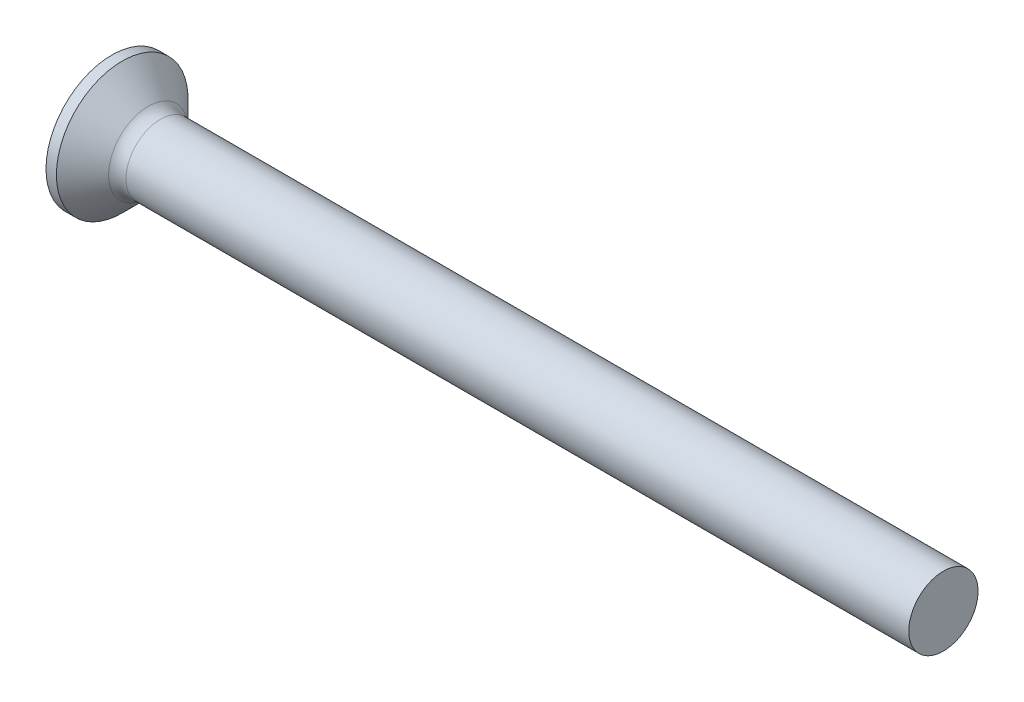
ISO-10303-21;
HEADER;
FILE_DESCRIPTION(('STEP AP214'),'2;1');
FILE_NAME('part.step','',(''),(''),'','','');
FILE_SCHEMA(('AUTOMOTIVE_DESIGN { 1 0 10303 214 1 1 1 1 }'));
ENDSEC;
DATA;
#1=APPLICATION_CONTEXT('core data for automotive mechanical design processes');
#2=APPLICATION_PROTOCOL_DEFINITION('international standard','automotive_design',2000,#1);
#3=PRODUCT_CONTEXT('',#1,'mechanical');
#4=PRODUCT('Part','Part','',(#3));
#5=PRODUCT_RELATED_PRODUCT_CATEGORY('part','',(#4));
#6=PRODUCT_DEFINITION_FORMATION('','',#4);
#7=PRODUCT_DEFINITION_CONTEXT('part definition',#1,'design');
#8=PRODUCT_DEFINITION('design','',#6,#7);
#9=PRODUCT_DEFINITION_SHAPE('','',#8);
#10=(LENGTH_UNIT() NAMED_UNIT(*) SI_UNIT(.MILLI.,.METRE.));
#11=(NAMED_UNIT(*) PLANE_ANGLE_UNIT() SI_UNIT($,.RADIAN.));
#12=(NAMED_UNIT(*) SI_UNIT($,.STERADIAN.) SOLID_ANGLE_UNIT());
#13=UNCERTAINTY_MEASURE_WITH_UNIT(LENGTH_MEASURE(1.E-05),#10,'distance_accuracy_value','');
#14=(GEOMETRIC_REPRESENTATION_CONTEXT(3) GLOBAL_UNCERTAINTY_ASSIGNED_CONTEXT((#13)) GLOBAL_UNIT_ASSIGNED_CONTEXT((#10,
#11,#12)) REPRESENTATION_CONTEXT('',''));
#15=CARTESIAN_POINT('',(0.,0.,0.));
#16=DIRECTION('',(0.,0.,1.));
#17=DIRECTION('',(1.,0.,0.));
#18=AXIS2_PLACEMENT_3D('',#15,#16,#17);
#19=CARTESIAN_POINT('',(0.,0.,0.));
#20=DIRECTION('',(-1.,0.,0.));
#21=DIRECTION('',(0.,0.,1.));
#22=AXIS2_PLACEMENT_3D('',#19,#20,#21);
#23=PLANE('',#22);
#24=CARTESIAN_POINT('',(0.,0.,0.));
#25=DIRECTION('',(-1.,0.,0.));
#26=DIRECTION('',(0.,0.,1.));
#27=AXIS2_PLACEMENT_3D('',#24,#25,#26);
#28=CIRCLE('',#27,1.9);
#29=CARTESIAN_POINT('',(0.,0.,1.9));
#30=VERTEX_POINT('',#29);
#31=EDGE_CURVE('E344',#30,#30,#28,.T.);
#32=ORIENTED_EDGE('',*,*,#31,.T.);
#33=EDGE_LOOP('',(#32));
#34=FACE_BOUND('',#33,.T.);
#35=DIRECTION('',(0.,0.,-1.));
#36=VECTOR('',#35,1.);
#37=CARTESIAN_POINT('',(0.,-0.240000000000003,0.949999999999999));
#38=LINE('',#37,#36);
#39=CARTESIAN_POINT('',(0.,-0.240000000000003,0.949999999999999));
#40=VERTEX_POINT('',#39);
#41=CARTESIAN_POINT('',(0.,-0.240000000000001,0.368080234393745));
#42=VERTEX_POINT('',#41);
#43=EDGE_CURVE('E383',#40,#42,#38,.T.);
#44=ORIENTED_EDGE('',*,*,#43,.T.);
#45=CARTESIAN_POINT('',(0.,0.,0.));
#46=DIRECTION('',(-1.,0.,0.));
#47=DIRECTION('',(0.,0.,1.));
#48=AXIS2_PLACEMENT_3D('',#45,#46,#47);
#49=CIRCLE('',#48,0.439412174332203);
#50=CARTESIAN_POINT('',(0.,-0.368080234393745,0.24));
#51=VERTEX_POINT('',#50);
#52=EDGE_CURVE('E370',#51,#42,#49,.T.);
#53=ORIENTED_EDGE('',*,*,#52,.F.);
#54=DIRECTION('',(0.,-1.,0.));
#55=VECTOR('',#54,1.);
#56=CARTESIAN_POINT('',(0.,0.95,0.24));
#57=LINE('',#56,#55);
#58=CARTESIAN_POINT('',(0.,-0.95,0.24));
#59=VERTEX_POINT('',#58);
#60=EDGE_CURVE('E430',#51,#59,#57,.T.);
#61=ORIENTED_EDGE('',*,*,#60,.T.);
#62=DIRECTION('',(0.,0.,-1.));
#63=VECTOR('',#62,1.);
#64=CARTESIAN_POINT('',(0.,-0.95,0.24));
#65=LINE('',#64,#63);
#66=CARTESIAN_POINT('',(0.,-0.95,-0.24));
#67=VERTEX_POINT('',#66);
#68=EDGE_CURVE('E341',#59,#67,#65,.T.);
#69=ORIENTED_EDGE('',*,*,#68,.T.);
#70=DIRECTION('',(0.,1.,0.));
#71=VECTOR('',#70,1.);
#72=CARTESIAN_POINT('',(0.,-0.95,-0.24));
#73=LINE('',#72,#71);
#74=CARTESIAN_POINT('',(0.,-0.368080234393745,-0.24));
#75=VERTEX_POINT('',#74);
#76=EDGE_CURVE('E431',#67,#75,#73,.T.);
#77=ORIENTED_EDGE('',*,*,#76,.T.);
#78=CARTESIAN_POINT('',(0.,-0.239999999999999,-0.368080234393746));
#79=VERTEX_POINT('',#78);
#80=EDGE_CURVE('E376',#79,#75,#49,.T.);
#81=ORIENTED_EDGE('',*,*,#80,.F.);
#82=CARTESIAN_POINT('',(0.,-0.239999999999997,-0.950000000000001));
#83=VERTEX_POINT('',#82);
#84=EDGE_CURVE('E392',#79,#83,#38,.T.);
#85=ORIENTED_EDGE('',*,*,#84,.T.);
#86=DIRECTION('',(0.,1.,0.));
#87=VECTOR('',#86,1.);
#88=CARTESIAN_POINT('',(0.,-0.239999999999997,-0.950000000000001));
#89=LINE('',#88,#87);
#90=CARTESIAN_POINT('',(0.,0.240000000000003,-0.949999999999999));
#91=VERTEX_POINT('',#90);
#92=EDGE_CURVE('E391',#83,#91,#89,.T.);
#93=ORIENTED_EDGE('',*,*,#92,.T.);
#94=DIRECTION('',(0.,0.,1.));
#95=VECTOR('',#94,1.);
#96=CARTESIAN_POINT('',(0.,0.240000000000003,-0.949999999999999));
#97=LINE('',#96,#95);
#98=CARTESIAN_POINT('',(0.,0.240000000000001,-0.368080234393745));
#99=VERTEX_POINT('',#98);
#100=EDGE_CURVE('E398',#91,#99,#97,.T.);
#101=ORIENTED_EDGE('',*,*,#100,.T.);
#102=CARTESIAN_POINT('',(0.,0.368080234393745,-0.24));
#103=VERTEX_POINT('',#102);
#104=EDGE_CURVE('E466',#103,#99,#49,.T.);
#105=ORIENTED_EDGE('',*,*,#104,.F.);
#106=CARTESIAN_POINT('',(0.,0.95,-0.24));
#107=VERTEX_POINT('',#106);
#108=EDGE_CURVE('E439',#103,#107,#73,.T.);
#109=ORIENTED_EDGE('',*,*,#108,.T.);
#110=DIRECTION('',(0.,0.,1.));
#111=VECTOR('',#110,1.);
#112=CARTESIAN_POINT('',(0.,0.95,-0.24));
#113=LINE('',#112,#111);
#114=CARTESIAN_POINT('',(0.,0.95,0.24));
#115=VERTEX_POINT('',#114);
#116=EDGE_CURVE('E427',#107,#115,#113,.T.);
#117=ORIENTED_EDGE('',*,*,#116,.T.);
#118=CARTESIAN_POINT('',(0.,0.368080234393745,0.24));
#119=VERTEX_POINT('',#118);
#120=EDGE_CURVE('E432',#115,#119,#57,.T.);
#121=ORIENTED_EDGE('',*,*,#120,.T.);
#122=CARTESIAN_POINT('',(0.,0.239999999999999,0.368080234393746));
#123=VERTEX_POINT('',#122);
#124=EDGE_CURVE('E378',#123,#119,#49,.T.);
#125=ORIENTED_EDGE('',*,*,#124,.F.);
#126=CARTESIAN_POINT('',(0.,0.239999999999997,0.950000000000001));
#127=VERTEX_POINT('',#126);
#128=EDGE_CURVE('E401',#123,#127,#97,.T.);
#129=ORIENTED_EDGE('',*,*,#128,.T.);
#130=DIRECTION('',(0.,-1.,0.));
#131=VECTOR('',#130,1.);
#132=CARTESIAN_POINT('',(0.,0.239999999999997,0.950000000000001));
#133=LINE('',#132,#131);
#134=EDGE_CURVE('E390',#127,#40,#133,.T.);
#135=ORIENTED_EDGE('',*,*,#134,.T.);
#136=EDGE_LOOP('',(#44,#53,#61,#69,#77,#81,#85,#93,#101,#105,#109,#117,#121,#125,#129,#135));
#137=FACE_BOUND('',#136,.T.);
#138=ADVANCED_FACE('F37',(#34,#137),#23,.T.);
#139=CARTESIAN_POINT('',(0.,-0.949999999999999,0.24));
#140=DIRECTION('',(0.,0.,-1.));
#141=DIRECTION('',(0.,1.,0.));
#142=AXIS2_PLACEMENT_3D('',#139,#140,#141);
#143=PLANE('',#142);
#144=ORIENTED_EDGE('',*,*,#60,.F.);
#145=CARTESIAN_POINT('',(-0.647693210421638,-0.421114336989891,0.24));
#146=CARTESIAN_POINT('',(-0.514503449539821,-0.410390261082994,0.24));
#147=CARTESIAN_POINT('',(-0.381320940230654,-0.399574318210381,0.24));
#148=CARTESIAN_POINT('',(-0.114973765657541,-0.377686644384344,0.24));
#149=CARTESIAN_POINT('',(0.0181908991048064,-0.366614907333785,0.24));
#150=CARTESIAN_POINT('',(0.284492634007954,-0.344144100394554,0.24));
#151=CARTESIAN_POINT('',(0.417629704159725,-0.332745030636282,0.24));
#152=CARTESIAN_POINT('',(0.683863247577946,-0.309504122508032,0.24));
#153=CARTESIAN_POINT('',(0.816959721458451,-0.297662291208049,0.24));
#154=CARTESIAN_POINT('',(1.04303435438055,-0.277010154534468,0.24));
#155=CARTESIAN_POINT('',(1.13602713245196,-0.268360479226193,0.24));
#156=CARTESIAN_POINT('',(1.32197255819723,-0.250648380041589,0.24));
#157=CARTESIAN_POINT('',(1.41492520622595,-0.241585959893612,0.24));
#158=CARTESIAN_POINT('',(1.60078125425266,-0.222904447218474,0.24));
#159=CARTESIAN_POINT('',(1.69368465086432,-0.213285320435301,0.24));
#160=CARTESIAN_POINT('',(1.87939874419459,-0.193166747195666,0.24));
#161=CARTESIAN_POINT('',(1.97220943766423,-0.182667270910302,0.24));
#162=CARTESIAN_POINT('',(2.0649517678624,-0.171565852393332,0.24));
#163=B_SPLINE_CURVE_WITH_KNOTS('',3,(#145,#146,#147,#148,#149,#150,#151,#152,#153,#154,#155,
#156,#157,#158,#159,#160,#161,#162),.UNSPECIFIED.,.F.,.F.,(4,2,2,2,2,2,2,2,4),(0.,
0.400862588724007,0.801734742325294,1.2026067362345,1.60347233177046,1.88365413960954,
2.16383341704974,2.44402995322111,2.72423598713696),.UNSPECIFIED.);
#164=CARTESIAN_POINT('',(1.2,-0.262259890185288,0.240000000000001));
#165=VERTEX_POINT('',#164);
#166=EDGE_CURVE('E373',#51,#165,#163,.T.);
#167=ORIENTED_EDGE('',*,*,#166,.T.);
#168=DIRECTION('',(0.,-1.,0.));
#169=VECTOR('',#168,1.);
#170=CARTESIAN_POINT('',(1.2,0.351702170390124,0.24));
#171=LINE('',#170,#169);
#172=CARTESIAN_POINT('',(1.2,-0.351702170390124,0.24));
#173=VERTEX_POINT('',#172);
#174=EDGE_CURVE('E446',#165,#173,#171,.T.);
#175=ORIENTED_EDGE('',*,*,#174,.T.);
#176=DIRECTION('',(0.894934391398443,0.446197753347436,0.));
#177=VECTOR('',#176,1.);
#178=CARTESIAN_POINT('',(0.,-0.95,0.24));
#179=LINE('',#178,#177);
#180=EDGE_CURVE('E319',#59,#173,#179,.T.);
#181=ORIENTED_EDGE('',*,*,#180,.F.);
#182=EDGE_LOOP('',(#144,#167,#175,#181));
#183=FACE_BOUND('',#182,.T.);
#184=ADVANCED_FACE('F191',(#183),#143,.T.);
#185=CARTESIAN_POINT('',(1.2,0.351702170390124,0.24));
#186=VERTEX_POINT('',#185);
#187=CARTESIAN_POINT('',(1.2,0.262259890185288,0.24));
#188=VERTEX_POINT('',#187);
#189=EDGE_CURVE('E328',#186,#188,#171,.T.);
#190=ORIENTED_EDGE('',*,*,#189,.T.);
#191=CARTESIAN_POINT('',(-0.647693210421638,0.421114336989891,0.24));
#192=CARTESIAN_POINT('',(-0.514503449539821,0.410390261082994,0.24));
#193=CARTESIAN_POINT('',(-0.381320940230654,0.399574318210381,0.24));
#194=CARTESIAN_POINT('',(-0.114973765657541,0.377686644384344,0.24));
#195=CARTESIAN_POINT('',(0.0181908991048065,0.366614907333785,0.24));
#196=CARTESIAN_POINT('',(0.284492634007954,0.344144100394554,0.24));
#197=CARTESIAN_POINT('',(0.417629704159725,0.332745030636282,0.24));
#198=CARTESIAN_POINT('',(0.683863247577946,0.309504122508032,0.24));
#199=CARTESIAN_POINT('',(0.816959721458451,0.297662291208049,0.24));
#200=CARTESIAN_POINT('',(1.04303435438056,0.277010154534468,0.24));
#201=CARTESIAN_POINT('',(1.13602713245196,0.268360479226193,0.24));
#202=CARTESIAN_POINT('',(1.32197255819723,0.250648380041589,0.24));
#203=CARTESIAN_POINT('',(1.41492520622595,0.241585959893612,0.24));
#204=CARTESIAN_POINT('',(1.60078125425266,0.222904447218474,0.24));
#205=CARTESIAN_POINT('',(1.69368465086432,0.213285320435301,0.24));
#206=CARTESIAN_POINT('',(1.87939874419459,0.193166747195666,0.24));
#207=CARTESIAN_POINT('',(1.97220943766423,0.182667270910302,0.24));
#208=CARTESIAN_POINT('',(2.0649517678624,0.171565852393332,0.24));
#209=B_SPLINE_CURVE_WITH_KNOTS('',3,(#191,#192,#193,#194,#195,#196,#197,#198,#199,#200,#201,
#202,#203,#204,#205,#206,#207,#208),.UNSPECIFIED.,.F.,.F.,(4,2,2,2,2,2,2,2,4),(0.,
0.400862588724007,0.801734742325293,1.2026067362345,1.60347233177046,1.88365413960954,
2.16383341704974,2.44402995322111,2.72423598713696),.UNSPECIFIED.);
#210=EDGE_CURVE('E251',#188,#119,#209,.F.);
#211=ORIENTED_EDGE('',*,*,#210,.T.);
#212=ORIENTED_EDGE('',*,*,#120,.F.);
#213=DIRECTION('',(0.894934391398443,-0.446197753347436,0.));
#214=VECTOR('',#213,1.);
#215=CARTESIAN_POINT('',(0.,0.95,0.24));
#216=LINE('',#215,#214);
#217=EDGE_CURVE('E60',#115,#186,#216,.T.);
#218=ORIENTED_EDGE('',*,*,#217,.T.);
#219=EDGE_LOOP('',(#190,#211,#212,#218));
#220=FACE_BOUND('',#219,.T.);
#221=ADVANCED_FACE('F196',(#220),#143,.T.);
#222=CARTESIAN_POINT('',(0.,0.949999999999999,-0.24));
#223=DIRECTION('',(0.,0.,1.));
#224=DIRECTION('',(1.,0.,0.));
#225=AXIS2_PLACEMENT_3D('',#222,#223,#224);
#226=PLANE('',#225);
#227=DIRECTION('',(0.,1.,0.));
#228=VECTOR('',#227,1.);
#229=CARTESIAN_POINT('',(1.2,-0.351702170390124,-0.24));
#230=LINE('',#229,#228);
#231=CARTESIAN_POINT('',(1.2,-0.351702170390124,-0.24));
#232=VERTEX_POINT('',#231);
#233=CARTESIAN_POINT('',(1.2,-0.262259890185288,-0.24));
#234=VERTEX_POINT('',#233);
#235=EDGE_CURVE('E332',#232,#234,#230,.T.);
#236=ORIENTED_EDGE('',*,*,#235,.T.);
#237=CARTESIAN_POINT('',(-0.647693210421638,-0.421114336989891,-0.24));
#238=CARTESIAN_POINT('',(-0.514503449539821,-0.410390261082994,-0.24));
#239=CARTESIAN_POINT('',(-0.381320940230654,-0.399574318210381,-0.24));
#240=CARTESIAN_POINT('',(-0.114973765657541,-0.377686644384344,-0.24));
#241=CARTESIAN_POINT('',(0.0181908991048066,-0.366614907333785,-0.24));
#242=CARTESIAN_POINT('',(0.284492634007954,-0.344144100394554,-0.24));
#243=CARTESIAN_POINT('',(0.417629704159725,-0.332745030636282,-0.24));
#244=CARTESIAN_POINT('',(0.683863247577946,-0.309504122508032,-0.24));
#245=CARTESIAN_POINT('',(0.816959721458451,-0.297662291208049,-0.24));
#246=CARTESIAN_POINT('',(1.04303435438056,-0.277010154534468,-0.24));
#247=CARTESIAN_POINT('',(1.13602713245196,-0.268360479226193,-0.24));
#248=CARTESIAN_POINT('',(1.32197255819723,-0.250648380041589,-0.24));
#249=CARTESIAN_POINT('',(1.41492520622595,-0.241585959893612,-0.24));
#250=CARTESIAN_POINT('',(1.60078125425266,-0.222904447218474,-0.24));
#251=CARTESIAN_POINT('',(1.69368465086432,-0.213285320435301,-0.24));
#252=CARTESIAN_POINT('',(1.87939874419459,-0.193166747195666,-0.24));
#253=CARTESIAN_POINT('',(1.97220943766423,-0.182667270910302,-0.24));
#254=CARTESIAN_POINT('',(2.0649517678624,-0.171565852393332,-0.24));
#255=B_SPLINE_CURVE_WITH_KNOTS('',3,(#237,#238,#239,#240,#241,#242,#243,#244,#245,#246,#247,
#248,#249,#250,#251,#252,#253,#254),.UNSPECIFIED.,.F.,.F.,(4,2,2,2,2,2,2,2,4),(0.,
0.400862588724007,0.801734742325294,1.2026067362345,1.60347233177046,1.88365413960954,
2.16383341704974,2.44402995322111,2.72423598713696),.UNSPECIFIED.);
#256=EDGE_CURVE('E245',#234,#75,#255,.F.);
#257=ORIENTED_EDGE('',*,*,#256,.T.);
#258=ORIENTED_EDGE('',*,*,#76,.F.);
#259=DIRECTION('',(0.894934391398443,0.446197753347436,0.));
#260=VECTOR('',#259,1.);
#261=CARTESIAN_POINT('',(0.,-0.95,-0.24));
#262=LINE('',#261,#260);
#263=EDGE_CURVE('E441',#67,#232,#262,.T.);
#264=ORIENTED_EDGE('',*,*,#263,.T.);
#265=EDGE_LOOP('',(#236,#257,#258,#264));
#266=FACE_BOUND('',#265,.T.);
#267=ADVANCED_FACE('F231',(#266),#226,.T.);
#268=ORIENTED_EDGE('',*,*,#108,.F.);
#269=CARTESIAN_POINT('',(-0.647693210410767,0.421114336989016,-0.24));
#270=CARTESIAN_POINT('',(-0.514503449530112,0.410390261082207,-0.24));
#271=CARTESIAN_POINT('',(-0.381320940222106,0.399574318209684,-0.24));
#272=CARTESIAN_POINT('',(-0.114973765651316,0.377686644383828,-0.24));
#273=CARTESIAN_POINT('',(0.0181908991098697,0.366614907333361,-0.24));
#274=CARTESIAN_POINT('',(0.284492634009302,0.344144100394437,-0.24));
#275=CARTESIAN_POINT('',(0.417629704158519,0.332745030636383,-0.24));
#276=CARTESIAN_POINT('',(0.683863247571635,0.309504122508587,-0.24));
#277=CARTESIAN_POINT('',(0.816959721449588,0.29766229120884,-0.24));
#278=CARTESIAN_POINT('',(1.04303435436914,0.277010154535523,-0.24));
#279=CARTESIAN_POINT('',(1.13602713244054,0.268360479227263,-0.24));
#280=CARTESIAN_POINT('',(1.32197255818582,0.250648380042693,-0.24));
#281=CARTESIAN_POINT('',(1.41492520621454,0.241585959894735,-0.24));
#282=CARTESIAN_POINT('',(1.60078125424125,0.222904447219644,-0.24));
#283=CARTESIAN_POINT('',(1.69368465085292,0.213285320436499,-0.24));
#284=CARTESIAN_POINT('',(1.8793987441832,0.193166747196935,-0.24));
#285=CARTESIAN_POINT('',(1.97220943765284,0.182667270911615,-0.24));
#286=CARTESIAN_POINT('',(2.06495176785102,0.171565852394701,-0.24));
#287=B_SPLINE_CURVE_WITH_KNOTS('',3,(#269,#270,#271,#272,#273,#274,#275,#276,#277,#278,#279,
#280,#281,#282,#283,#284,#285,#286),.UNSPECIFIED.,.F.,.F.,(4,2,2,2,2,2,2,2,4),(0.,
0.400862588720512,0.801734742318303,1.20260673621982,1.60347233174809,1.88365413958718,
2.16383341702737,2.44402995319874,2.72423598711459),.UNSPECIFIED.);
#288=CARTESIAN_POINT('',(1.2,0.262259890185288,-0.24));
#289=VERTEX_POINT('',#288);
#290=EDGE_CURVE('E239',#103,#289,#287,.T.);
#291=ORIENTED_EDGE('',*,*,#290,.T.);
#292=CARTESIAN_POINT('',(1.2,0.351702170390124,-0.24));
#293=VERTEX_POINT('',#292);
#294=EDGE_CURVE('E336',#289,#293,#230,.T.);
#295=ORIENTED_EDGE('',*,*,#294,.T.);
#296=DIRECTION('',(0.894934391398443,-0.446197753347436,0.));
#297=VECTOR('',#296,1.);
#298=CARTESIAN_POINT('',(0.,0.95,-0.24));
#299=LINE('',#298,#297);
#300=EDGE_CURVE('E323',#107,#293,#299,.T.);
#301=ORIENTED_EDGE('',*,*,#300,.F.);
#302=EDGE_LOOP('',(#268,#291,#295,#301));
#303=FACE_BOUND('',#302,.T.);
#304=ADVANCED_FACE('F223',(#303),#226,.T.);
#305=CARTESIAN_POINT('',(1.2,0.351702170390124,-0.24));
#306=DIRECTION('',(1.,0.,0.));
#307=DIRECTION('',(0.,0.,-1.));
#308=AXIS2_PLACEMENT_3D('',#305,#306,#307);
#309=PLANE('',#308);
#310=CARTESIAN_POINT('',(1.2,0.,0.));
#311=DIRECTION('',(-1.,0.,0.));
#312=DIRECTION('',(0.,0.,1.));
#313=AXIS2_PLACEMENT_3D('',#310,#311,#312);
#314=CIRCLE('',#313,0.355499999999999);
#315=CARTESIAN_POINT('',(1.2,-0.0518250262216575,-0.351702170390124));
#316=VERTEX_POINT('',#315);
#317=CARTESIAN_POINT('',(1.2,-0.239999999999999,-0.262259890185289));
#318=VERTEX_POINT('',#317);
#319=EDGE_CURVE('E513',#316,#318,#314,.T.);
#320=ORIENTED_EDGE('',*,*,#319,.F.);
#321=DIRECTION('',(0.,1.,0.));
#322=VECTOR('',#321,1.);
#323=CARTESIAN_POINT('',(1.2,-0.239999999999999,-0.351702170390125));
#324=LINE('',#323,#322);
#325=CARTESIAN_POINT('',(1.2,-0.239999999999999,-0.351702170390125));
#326=VERTEX_POINT('',#325);
#327=EDGE_CURVE('E413',#326,#316,#324,.T.);
#328=ORIENTED_EDGE('',*,*,#327,.F.);
#329=DIRECTION('',(0.,0.,-1.));
#330=VECTOR('',#329,1.);
#331=CARTESIAN_POINT('',(1.2,-0.240000000000001,0.351702170390123));
#332=LINE('',#331,#330);
#333=EDGE_CURVE('E417',#318,#326,#332,.T.);
#334=ORIENTED_EDGE('',*,*,#333,.F.);
#335=EDGE_LOOP('',(#320,#328,#334));
#336=FACE_BOUND('',#335,.T.);
#337=ADVANCED_FACE('F219',(#336),#309,.F.);
#338=CARTESIAN_POINT('',(1.2,-0.351702170390124,-0.0518250262216578));
#339=VERTEX_POINT('',#338);
#340=EDGE_CURVE('E484',#234,#339,#314,.T.);
#341=ORIENTED_EDGE('',*,*,#340,.F.);
#342=ORIENTED_EDGE('',*,*,#235,.F.);
#343=DIRECTION('',(0.,0.,-1.));
#344=VECTOR('',#343,1.);
#345=CARTESIAN_POINT('',(1.2,-0.351702170390124,0.24));
#346=LINE('',#345,#344);
#347=EDGE_CURVE('E324',#339,#232,#346,.T.);
#348=ORIENTED_EDGE('',*,*,#347,.F.);
#349=EDGE_LOOP('',(#341,#342,#348));
#350=FACE_BOUND('',#349,.T.);
#351=ADVANCED_FACE('F222',(#350),#309,.F.);
#352=CARTESIAN_POINT('',(1.2,-0.351702170390124,0.051825026221658));
#353=VERTEX_POINT('',#352);
#354=EDGE_CURVE('E480',#353,#165,#314,.T.);
#355=ORIENTED_EDGE('',*,*,#354,.F.);
#356=EDGE_CURVE('E314',#173,#353,#346,.T.);
#357=ORIENTED_EDGE('',*,*,#356,.F.);
#358=ORIENTED_EDGE('',*,*,#174,.F.);
#359=EDGE_LOOP('',(#355,#357,#358));
#360=FACE_BOUND('',#359,.T.);
#361=ADVANCED_FACE('F478',(#360),#309,.F.);
#362=CARTESIAN_POINT('',(1.2,-0.240000000000001,0.262259890185288));
#363=VERTEX_POINT('',#362);
#364=CARTESIAN_POINT('',(1.2,-0.0518250262216547,0.351702170390124));
#365=VERTEX_POINT('',#364);
#366=EDGE_CURVE('E52',#363,#365,#314,.T.);
#367=ORIENTED_EDGE('',*,*,#366,.F.);
#368=CARTESIAN_POINT('',(1.2,-0.240000000000001,0.351702170390123));
#369=VERTEX_POINT('',#368);
#370=EDGE_CURVE('E386',#369,#363,#332,.T.);
#371=ORIENTED_EDGE('',*,*,#370,.F.);
#372=DIRECTION('',(0.,-1.,0.));
#373=VECTOR('',#372,1.);
#374=CARTESIAN_POINT('',(1.2,0.239999999999999,0.351702170390125));
#375=LINE('',#374,#373);
#376=EDGE_CURVE('E418',#365,#369,#375,.T.);
#377=ORIENTED_EDGE('',*,*,#376,.F.);
#378=EDGE_LOOP('',(#367,#371,#377));
#379=FACE_BOUND('',#378,.T.);
#380=ADVANCED_FACE('F524',(#379),#309,.F.);
#381=CARTESIAN_POINT('',(1.2,0.0518250262216565,0.351702170390125));
#382=VERTEX_POINT('',#381);
#383=CARTESIAN_POINT('',(1.2,0.239999999999999,0.262259890185289));
#384=VERTEX_POINT('',#383);
#385=EDGE_CURVE('E377',#382,#384,#314,.T.);
#386=ORIENTED_EDGE('',*,*,#385,.F.);
#387=CARTESIAN_POINT('',(1.2,0.239999999999999,0.351702170390125));
#388=VERTEX_POINT('',#387);
#389=EDGE_CURVE('E414',#388,#382,#375,.T.);
#390=ORIENTED_EDGE('',*,*,#389,.F.);
#391=DIRECTION('',(0.,0.,1.));
#392=VECTOR('',#391,1.);
#393=CARTESIAN_POINT('',(1.2,0.240000000000001,-0.351702170390124));
#394=LINE('',#393,#392);
#395=EDGE_CURVE('E426',#384,#388,#394,.T.);
#396=ORIENTED_EDGE('',*,*,#395,.F.);
#397=EDGE_LOOP('',(#386,#390,#396));
#398=FACE_BOUND('',#397,.T.);
#399=ADVANCED_FACE('F489',(#398),#309,.F.);
#400=CARTESIAN_POINT('',(1.2,0.351702170390124,0.051825026221657));
#401=VERTEX_POINT('',#400);
#402=EDGE_CURVE('E458',#188,#401,#314,.T.);
#403=ORIENTED_EDGE('',*,*,#402,.F.);
#404=ORIENTED_EDGE('',*,*,#189,.F.);
#405=DIRECTION('',(0.,0.,1.));
#406=VECTOR('',#405,1.);
#407=CARTESIAN_POINT('',(1.2,0.351702170390124,-0.24));
#408=LINE('',#407,#406);
#409=EDGE_CURVE('E335',#401,#186,#408,.T.);
#410=ORIENTED_EDGE('',*,*,#409,.F.);
#411=EDGE_LOOP('',(#403,#404,#410));
#412=FACE_BOUND('',#411,.T.);
#413=ADVANCED_FACE('F456',(#412),#309,.F.);
#414=CARTESIAN_POINT('',(1.2,0.351702170390124,-0.0518250262216572));
#415=VERTEX_POINT('',#414);
#416=EDGE_CURVE('E464',#415,#289,#314,.T.);
#417=ORIENTED_EDGE('',*,*,#416,.F.);
#418=EDGE_CURVE('E444',#293,#415,#408,.T.);
#419=ORIENTED_EDGE('',*,*,#418,.F.);
#420=ORIENTED_EDGE('',*,*,#294,.F.);
#421=EDGE_LOOP('',(#417,#419,#420));
#422=FACE_BOUND('',#421,.T.);
#423=ADVANCED_FACE('F308',(#422),#309,.F.);
#424=CARTESIAN_POINT('',(1.2,0.240000000000001,-0.262259890185288));
#425=VERTEX_POINT('',#424);
#426=CARTESIAN_POINT('',(1.2,0.0518250262216598,-0.351702170390124));
#427=VERTEX_POINT('',#426);
#428=EDGE_CURVE('E507',#425,#427,#314,.T.);
#429=ORIENTED_EDGE('',*,*,#428,.F.);
#430=CARTESIAN_POINT('',(1.2,0.240000000000001,-0.351702170390124));
#431=VERTEX_POINT('',#430);
#432=EDGE_CURVE('E423',#431,#425,#394,.T.);
#433=ORIENTED_EDGE('',*,*,#432,.F.);
#434=EDGE_CURVE('E420',#427,#431,#324,.T.);
#435=ORIENTED_EDGE('',*,*,#434,.F.);
#436=EDGE_LOOP('',(#429,#433,#435));
#437=FACE_BOUND('',#436,.T.);
#438=ADVANCED_FACE('F225',(#437),#309,.F.);
#439=CARTESIAN_POINT('',(0.,-0.95,-0.24));
#440=DIRECTION('',(-0.446197753347436,0.894934391398443,0.));
#441=DIRECTION('',(-0.894934391398443,-0.446197753347436,0.));
#442=AXIS2_PLACEMENT_3D('',#439,#440,#441);
#443=PLANE('',#442);
#444=ORIENTED_EDGE('',*,*,#356,.T.);
#445=CARTESIAN_POINT('',(1.81755053455844,-0.0438028833061813,0.));
#446=DIRECTION('',(-0.446197753347436,0.894934391398443,0.));
#447=DIRECTION('',(-0.894934391398443,-0.446197753347436,0.));
#448=AXIS2_PLACEMENT_3D('',#445,#446,#447);
#449=ELLIPSE('',#448,0.69995121571384,0.309229693703333);
#450=EDGE_CURVE('E315',#353,#339,#449,.F.);
#451=ORIENTED_EDGE('',*,*,#450,.T.);
#452=ORIENTED_EDGE('',*,*,#347,.T.);
#453=ORIENTED_EDGE('',*,*,#263,.F.);
#454=ORIENTED_EDGE('',*,*,#68,.F.);
#455=ORIENTED_EDGE('',*,*,#180,.T.);
#456=EDGE_LOOP('',(#444,#451,#452,#453,#454,#455));
#457=FACE_BOUND('',#456,.T.);
#458=ADVANCED_FACE('F230',(#457),#443,.T.);
#459=CARTESIAN_POINT('',(0.,0.95,0.24));
#460=DIRECTION('',(-0.446197753347436,-0.894934391398443,0.));
#461=DIRECTION('',(0.894934391398443,-0.446197753347436,0.));
#462=AXIS2_PLACEMENT_3D('',#459,#460,#461);
#463=PLANE('',#462);
#464=ORIENTED_EDGE('',*,*,#418,.T.);
#465=CARTESIAN_POINT('',(1.81755053455844,0.0438028833061814,0.));
#466=DIRECTION('',(-0.446197753347436,-0.894934391398443,0.));
#467=DIRECTION('',(-0.894934391398443,0.446197753347436,0.));
#468=AXIS2_PLACEMENT_3D('',#465,#466,#467);
#469=ELLIPSE('',#468,0.69995121571384,0.309229693703333);
#470=EDGE_CURVE('E292',#415,#401,#469,.F.);
#471=ORIENTED_EDGE('',*,*,#470,.T.);
#472=ORIENTED_EDGE('',*,*,#409,.T.);
#473=ORIENTED_EDGE('',*,*,#217,.F.);
#474=ORIENTED_EDGE('',*,*,#116,.F.);
#475=ORIENTED_EDGE('',*,*,#300,.T.);
#476=EDGE_LOOP('',(#464,#471,#472,#473,#474,#475));
#477=FACE_BOUND('',#476,.T.);
#478=ADVANCED_FACE('F226',(#477),#463,.T.);
#479=CARTESIAN_POINT('',(0.,0.239999999999997,0.95));
#480=DIRECTION('',(0.,-1.,0.));
#481=DIRECTION('',(1.,0.,0.));
#482=AXIS2_PLACEMENT_3D('',#479,#480,#481);
#483=PLANE('',#482);
#484=ORIENTED_EDGE('',*,*,#432,.T.);
#485=CARTESIAN_POINT('',(-0.647693210421638,0.240000000000001,-0.42111433698989));
#486=CARTESIAN_POINT('',(-0.514503449539822,0.240000000000001,-0.410390261082993));
#487=CARTESIAN_POINT('',(-0.381320940230654,0.240000000000001,-0.399574318210381));
#488=CARTESIAN_POINT('',(-0.114973765657541,0.240000000000001,-0.377686644384343));
#489=CARTESIAN_POINT('',(0.0181908991048064,0.240000000000001,-0.366614907333784));
#490=CARTESIAN_POINT('',(0.284492634007954,0.240000000000001,-0.344144100394553));
#491=CARTESIAN_POINT('',(0.417629704159725,0.240000000000001,-0.332745030636281));
#492=CARTESIAN_POINT('',(0.683863247577946,0.240000000000001,-0.309504122508031));
#493=CARTESIAN_POINT('',(0.816959721458451,0.240000000000001,-0.297662291208048));
#494=CARTESIAN_POINT('',(1.04303435438056,0.240000000000001,-0.277010154534467));
#495=CARTESIAN_POINT('',(1.13602713245196,0.240000000000001,-0.268360479226192));
#496=CARTESIAN_POINT('',(1.32197255819723,0.240000000000001,-0.250648380041589));
#497=CARTESIAN_POINT('',(1.41492520622595,0.240000000000001,-0.241585959893611));
#498=CARTESIAN_POINT('',(1.60078125425266,0.240000000000001,-0.222904447218473));
#499=CARTESIAN_POINT('',(1.69368465086432,0.240000000000001,-0.213285320435301));
#500=CARTESIAN_POINT('',(1.87939874419459,0.240000000000001,-0.193166747195665));
#501=CARTESIAN_POINT('',(1.97220943766423,0.240000000000001,-0.182667270910301));
#502=CARTESIAN_POINT('',(2.0649517678624,0.240000000000001,-0.171565852393331));
#503=B_SPLINE_CURVE_WITH_KNOTS('',3,(#485,#486,#487,#488,#489,#490,#491,#492,#493,#494,#495,
#496,#497,#498,#499,#500,#501,#502),.UNSPECIFIED.,.F.,.F.,(4,2,2,2,2,2,2,2,4),(0.,
0.400862588724007,0.801734742325294,1.2026067362345,1.60347233177046,1.88365413960954,
2.16383341704974,2.44402995322111,2.72423598713696),.UNSPECIFIED.);
#504=EDGE_CURVE('E285',#425,#99,#503,.F.);
#505=ORIENTED_EDGE('',*,*,#504,.T.);
#506=ORIENTED_EDGE('',*,*,#100,.F.);
#507=DIRECTION('',(0.894934391398443,0.,0.446197753347436));
#508=VECTOR('',#507,1.);
#509=CARTESIAN_POINT('',(0.,0.240000000000003,-0.949999999999999));
#510=LINE('',#509,#508);
#511=EDGE_CURVE('E405',#91,#431,#510,.T.);
#512=ORIENTED_EDGE('',*,*,#511,.T.);
#513=EDGE_LOOP('',(#484,#505,#506,#512));
#514=FACE_BOUND('',#513,.T.);
#515=ADVANCED_FACE('F229',(#514),#483,.T.);
#516=CARTESIAN_POINT('',(0.,-0.239999999999997,-0.95));
#517=DIRECTION('',(0.,1.,0.));
#518=DIRECTION('',(0.,0.,1.));
#519=AXIS2_PLACEMENT_3D('',#516,#517,#518);
#520=PLANE('',#519);
#521=ORIENTED_EDGE('',*,*,#84,.F.);
#522=CARTESIAN_POINT('',(-0.647693210410766,-0.239999999999999,-0.421114336989017));
#523=CARTESIAN_POINT('',(-0.514503449530112,-0.239999999999999,-0.410390261082208));
#524=CARTESIAN_POINT('',(-0.381320940222106,-0.239999999999999,-0.399574318209684));
#525=CARTESIAN_POINT('',(-0.114973765651316,-0.239999999999999,-0.377686644383829));
#526=CARTESIAN_POINT('',(0.0181908991098697,-0.239999999999999,-0.366614907333361));
#527=CARTESIAN_POINT('',(0.284492634009302,-0.239999999999999,-0.344144100394438));
#528=CARTESIAN_POINT('',(0.417629704158519,-0.239999999999999,-0.332745030636384));
#529=CARTESIAN_POINT('',(0.683863247571635,-0.239999999999999,-0.309504122508588));
#530=CARTESIAN_POINT('',(0.816959721449588,-0.239999999999999,-0.297662291208841));
#531=CARTESIAN_POINT('',(1.04303435436914,-0.239999999999999,-0.277010154535524));
#532=CARTESIAN_POINT('',(1.13602713244054,-0.239999999999999,-0.268360479227263));
#533=CARTESIAN_POINT('',(1.32197255818582,-0.239999999999999,-0.250648380042694));
#534=CARTESIAN_POINT('',(1.41492520621454,-0.239999999999999,-0.241585959894736));
#535=CARTESIAN_POINT('',(1.60078125424125,-0.239999999999999,-0.222904447219645));
#536=CARTESIAN_POINT('',(1.69368465085292,-0.239999999999999,-0.2132853204365));
#537=CARTESIAN_POINT('',(1.8793987441832,-0.239999999999999,-0.193166747196935));
#538=CARTESIAN_POINT('',(1.97220943765284,-0.239999999999999,-0.182667270911615));
#539=CARTESIAN_POINT('',(2.06495176785102,-0.239999999999999,-0.171565852394701));
#540=B_SPLINE_CURVE_WITH_KNOTS('',3,(#522,#523,#524,#525,#526,#527,#528,#529,#530,#531,#532,
#533,#534,#535,#536,#537,#538,#539),.UNSPECIFIED.,.F.,.F.,(4,2,2,2,2,2,2,2,4),(0.,
0.400862588720512,0.801734742318303,1.20260673621982,1.60347233174809,1.88365413958718,
2.16383341702737,2.44402995319874,2.72423598711459),.UNSPECIFIED.);
#541=EDGE_CURVE('E279',#79,#318,#540,.T.);
#542=ORIENTED_EDGE('',*,*,#541,.T.);
#543=ORIENTED_EDGE('',*,*,#333,.T.);
#544=DIRECTION('',(0.894934391398443,0.,0.446197753347436));
#545=VECTOR('',#544,1.);
#546=CARTESIAN_POINT('',(0.,-0.239999999999997,-0.950000000000001));
#547=LINE('',#546,#545);
#548=EDGE_CURVE('E402',#83,#326,#547,.T.);
#549=ORIENTED_EDGE('',*,*,#548,.F.);
#550=EDGE_LOOP('',(#521,#542,#543,#549));
#551=FACE_BOUND('',#550,.T.);
#552=ADVANCED_FACE('F296',(#551),#520,.T.);
#553=CARTESIAN_POINT('',(0.,0.240000000000003,-0.949999999999999));
#554=DIRECTION('',(-0.446197753347436,0.,0.894934391398443));
#555=DIRECTION('',(-0.894934391398443,0.,-0.446197753347436));
#556=AXIS2_PLACEMENT_3D('',#553,#554,#555);
#557=PLANE('',#556);
#558=ORIENTED_EDGE('',*,*,#327,.T.);
#559=CARTESIAN_POINT('',(1.81755053455844,0.,-0.0438028833061813));
#560=DIRECTION('',(-0.446197753347436,0.,0.894934391398443));
#561=DIRECTION('',(-0.894934391398443,0.,-0.446197753347436));
#562=AXIS2_PLACEMENT_3D('',#559,#560,#561);
#563=ELLIPSE('',#562,0.69995121571384,0.309229693703333);
#564=EDGE_CURVE('E387',#316,#427,#563,.F.);
#565=ORIENTED_EDGE('',*,*,#564,.T.);
#566=ORIENTED_EDGE('',*,*,#434,.T.);
#567=ORIENTED_EDGE('',*,*,#511,.F.);
#568=ORIENTED_EDGE('',*,*,#92,.F.);
#569=ORIENTED_EDGE('',*,*,#548,.T.);
#570=EDGE_LOOP('',(#558,#565,#566,#567,#568,#569));
#571=FACE_BOUND('',#570,.T.);
#572=ADVANCED_FACE('F258',(#571),#557,.T.);
#573=ORIENTED_EDGE('',*,*,#370,.T.);
#574=CARTESIAN_POINT('',(-0.647693210421638,-0.240000000000001,0.42111433698989));
#575=CARTESIAN_POINT('',(-0.514503449539822,-0.240000000000001,0.410390261082993));
#576=CARTESIAN_POINT('',(-0.381320940230654,-0.240000000000001,0.39957431821038));
#577=CARTESIAN_POINT('',(-0.114973765657541,-0.240000000000001,0.377686644384343));
#578=CARTESIAN_POINT('',(0.0181908991048064,-0.240000000000001,0.366614907333784));
#579=CARTESIAN_POINT('',(0.284492634007953,-0.240000000000001,0.344144100394553));
#580=CARTESIAN_POINT('',(0.417629704159725,-0.240000000000001,0.332745030636281));
#581=CARTESIAN_POINT('',(0.683863247577946,-0.240000000000001,0.309504122508031));
#582=CARTESIAN_POINT('',(0.816959721458451,-0.240000000000001,0.297662291208048));
#583=CARTESIAN_POINT('',(1.04303435438056,-0.240000000000001,0.277010154534467));
#584=CARTESIAN_POINT('',(1.13602713245196,-0.240000000000001,0.268360479226192));
#585=CARTESIAN_POINT('',(1.32197255819723,-0.240000000000001,0.250648380041589));
#586=CARTESIAN_POINT('',(1.41492520622595,-0.240000000000001,0.241585959893611));
#587=CARTESIAN_POINT('',(1.60078125425266,-0.240000000000001,0.222904447218473));
#588=CARTESIAN_POINT('',(1.69368465086432,-0.240000000000001,0.213285320435301));
#589=CARTESIAN_POINT('',(1.87939874419459,-0.240000000000001,0.193166747195665));
#590=CARTESIAN_POINT('',(1.97220943766423,-0.240000000000001,0.182667270910301));
#591=CARTESIAN_POINT('',(2.0649517678624,-0.240000000000001,0.171565852393331));
#592=B_SPLINE_CURVE_WITH_KNOTS('',3,(#574,#575,#576,#577,#578,#579,#580,#581,#582,#583,#584,
#585,#586,#587,#588,#589,#590,#591),.UNSPECIFIED.,.F.,.F.,(4,2,2,2,2,2,2,2,4),(0.,
0.400862588724007,0.801734742325293,1.2026067362345,1.60347233177046,1.88365413960955,
2.16383341704974,2.44402995322111,2.72423598713696),.UNSPECIFIED.);
#593=EDGE_CURVE('E272',#363,#42,#592,.F.);
#594=ORIENTED_EDGE('',*,*,#593,.T.);
#595=ORIENTED_EDGE('',*,*,#43,.F.);
#596=DIRECTION('',(0.894934391398443,0.,-0.446197753347436));
#597=VECTOR('',#596,1.);
#598=CARTESIAN_POINT('',(0.,-0.240000000000003,0.949999999999999));
#599=LINE('',#598,#597);
#600=EDGE_CURVE('E408',#40,#369,#599,.T.);
#601=ORIENTED_EDGE('',*,*,#600,.T.);
#602=EDGE_LOOP('',(#573,#594,#595,#601));
#603=FACE_BOUND('',#602,.T.);
#604=ADVANCED_FACE('F381',(#603),#520,.T.);
#605=ORIENTED_EDGE('',*,*,#128,.F.);
#606=CARTESIAN_POINT('',(-0.647693210421638,0.239999999999998,0.421114336989892));
#607=CARTESIAN_POINT('',(-0.514503449539821,0.239999999999998,0.410390261082995));
#608=CARTESIAN_POINT('',(-0.381320940230654,0.239999999999998,0.399574318210382));
#609=CARTESIAN_POINT('',(-0.114973765657541,0.239999999999999,0.377686644384345));
#610=CARTESIAN_POINT('',(0.0181908991048066,0.239999999999999,0.366614907333785));
#611=CARTESIAN_POINT('',(0.284492634007954,0.239999999999999,0.344144100394555));
#612=CARTESIAN_POINT('',(0.417629704159725,0.239999999999999,0.332745030636283));
#613=CARTESIAN_POINT('',(0.683863247577946,0.239999999999999,0.309504122508033));
#614=CARTESIAN_POINT('',(0.816959721458451,0.239999999999999,0.29766229120805));
#615=CARTESIAN_POINT('',(1.04303435438056,0.239999999999999,0.277010154534469));
#616=CARTESIAN_POINT('',(1.13602713245196,0.239999999999999,0.268360479226194));
#617=CARTESIAN_POINT('',(1.32197255819723,0.239999999999999,0.25064838004159));
#618=CARTESIAN_POINT('',(1.41492520622595,0.239999999999999,0.241585959893613));
#619=CARTESIAN_POINT('',(1.60078125425266,0.239999999999999,0.222904447218474));
#620=CARTESIAN_POINT('',(1.69368465086432,0.239999999999999,0.213285320435302));
#621=CARTESIAN_POINT('',(1.87939874419459,0.239999999999999,0.193166747195667));
#622=CARTESIAN_POINT('',(1.97220943766423,0.239999999999999,0.182667270910303));
#623=CARTESIAN_POINT('',(2.0649517678624,0.239999999999999,0.171565852393333));
#624=B_SPLINE_CURVE_WITH_KNOTS('',3,(#606,#607,#608,#609,#610,#611,#612,#613,#614,#615,#616,
#617,#618,#619,#620,#621,#622,#623),.UNSPECIFIED.,.F.,.F.,(4,2,2,2,2,2,2,2,4),(0.,
0.400862588724007,0.801734742325293,1.2026067362345,1.60347233177046,1.88365413960955,
2.16383341704974,2.44402995322111,2.72423598713696),.UNSPECIFIED.);
#625=EDGE_CURVE('E263',#123,#384,#624,.T.);
#626=ORIENTED_EDGE('',*,*,#625,.T.);
#627=ORIENTED_EDGE('',*,*,#395,.T.);
#628=DIRECTION('',(0.894934391398443,0.,-0.446197753347436));
#629=VECTOR('',#628,1.);
#630=CARTESIAN_POINT('',(0.,0.239999999999997,0.950000000000001));
#631=LINE('',#630,#629);
#632=EDGE_CURVE('E410',#127,#388,#631,.T.);
#633=ORIENTED_EDGE('',*,*,#632,.F.);
#634=EDGE_LOOP('',(#605,#626,#627,#633));
#635=FACE_BOUND('',#634,.T.);
#636=ADVANCED_FACE('F298',(#635),#483,.T.);
#637=CARTESIAN_POINT('',(0.,-0.240000000000003,0.949999999999999));
#638=DIRECTION('',(-0.446197753347436,0.,-0.894934391398443));
#639=DIRECTION('',(0.894934391398443,0.,-0.446197753347436));
#640=AXIS2_PLACEMENT_3D('',#637,#638,#639);
#641=PLANE('',#640);
#642=ORIENTED_EDGE('',*,*,#389,.T.);
#643=CARTESIAN_POINT('',(1.81755053455844,0.,0.0438028833061814));
#644=DIRECTION('',(-0.446197753347436,0.,-0.894934391398443));
#645=DIRECTION('',(-0.894934391398443,0.,0.446197753347436));
#646=AXIS2_PLACEMENT_3D('',#643,#644,#645);
#647=ELLIPSE('',#646,0.69995121571384,0.309229693703333);
#648=EDGE_CURVE('E11',#382,#365,#647,.F.);
#649=ORIENTED_EDGE('',*,*,#648,.T.);
#650=ORIENTED_EDGE('',*,*,#376,.T.);
#651=ORIENTED_EDGE('',*,*,#600,.F.);
#652=ORIENTED_EDGE('',*,*,#134,.F.);
#653=ORIENTED_EDGE('',*,*,#632,.T.);
#654=EDGE_LOOP('',(#642,#649,#650,#651,#652,#653));
#655=FACE_BOUND('',#654,.T.);
#656=ADVANCED_FACE('F206',(#655),#641,.T.);
#657=CARTESIAN_POINT('',(-6.34999999999999,0.,0.));
#658=DIRECTION('',(-1.,0.,0.));
#659=DIRECTION('',(0.,0.,1.));
#660=AXIS2_PLACEMENT_3D('',#657,#658,#659);
#661=CYLINDRICAL_SURFACE('',#660,1.9);
#662=CARTESIAN_POINT('',(0.300000000000003,0.,0.));
#663=DIRECTION('',(-1.,0.,0.));
#664=DIRECTION('',(0.,0.,1.));
#665=AXIS2_PLACEMENT_3D('',#662,#663,#664);
#666=CIRCLE('',#665,1.9);
#667=CARTESIAN_POINT('',(0.300000000000003,0.,1.9));
#668=VERTEX_POINT('',#667);
#669=EDGE_CURVE('E340',#668,#668,#666,.T.);
#670=ORIENTED_EDGE('',*,*,#669,.T.);
#671=EDGE_LOOP('',(#670));
#672=FACE_BOUND('',#671,.T.);
#673=ORIENTED_EDGE('',*,*,#31,.F.);
#674=EDGE_LOOP('',(#673));
#675=FACE_BOUND('',#674,.T.);
#676=ADVANCED_FACE('F202',(#672,#675),#661,.T.);
#677=CARTESIAN_POINT('',(0.300000000000003,0.,0.));
#678=DIRECTION('',(-1.,0.,0.));
#679=DIRECTION('',(0.,0.,1.));
#680=AXIS2_PLACEMENT_3D('',#677,#678,#679);
#681=CONICAL_SURFACE('',#680,1.9,0.78539816339745);
#682=CARTESIAN_POINT('',(1.05355339059327,0.,0.));
#683=DIRECTION('',(-1.,0.,0.));
#684=DIRECTION('',(0.,0.,1.));
#685=AXIS2_PLACEMENT_3D('',#682,#683,#684);
#686=CIRCLE('',#685,1.14644660940673);
#687=CARTESIAN_POINT('',(1.05355339059327,0.,1.14644660940673));
#688=VERTEX_POINT('',#687);
#689=EDGE_CURVE('E346',#688,#688,#686,.T.);
#690=ORIENTED_EDGE('',*,*,#689,.T.);
#691=EDGE_LOOP('',(#690));
#692=FACE_BOUND('',#691,.T.);
#693=ORIENTED_EDGE('',*,*,#669,.F.);
#694=EDGE_LOOP('',(#693));
#695=FACE_BOUND('',#694,.T.);
#696=ADVANCED_FACE('F205',(#692,#695),#681,.T.);
#697=CARTESIAN_POINT('',(-6.34999999999999,0.,0.));
#698=DIRECTION('',(-1.,0.,0.));
#699=DIRECTION('',(0.,0.,1.));
#700=AXIS2_PLACEMENT_3D('',#697,#698,#699);
#701=CYLINDRICAL_SURFACE('',#700,1.);
#702=CARTESIAN_POINT('',(1.40710678118655,0.,0.));
#703=DIRECTION('',(-1.,0.,0.));
#704=DIRECTION('',(0.,0.,1.));
#705=AXIS2_PLACEMENT_3D('',#702,#703,#704);
#706=CIRCLE('',#705,1.);
#707=CARTESIAN_POINT('',(1.40710678118655,0.,1.));
#708=VERTEX_POINT('',#707);
#709=EDGE_CURVE('E45',#708,#708,#706,.F.);
#710=ORIENTED_EDGE('',*,*,#709,.T.);
#711=EDGE_LOOP('',(#710));
#712=FACE_BOUND('',#711,.T.);
#713=CARTESIAN_POINT('',(24.,0.,0.));
#714=DIRECTION('',(-1.,0.,0.));
#715=DIRECTION('',(0.,0.,1.));
#716=AXIS2_PLACEMENT_3D('',#713,#714,#715);
#717=CIRCLE('',#716,1.);
#718=CARTESIAN_POINT('',(24.,0.,1.));
#719=VERTEX_POINT('',#718);
#720=EDGE_CURVE('E337',#719,#719,#717,.T.);
#721=ORIENTED_EDGE('',*,*,#720,.T.);
#722=EDGE_LOOP('',(#721));
#723=FACE_BOUND('',#722,.T.);
#724=ADVANCED_FACE('F210',(#712,#723),#701,.T.);
#725=CARTESIAN_POINT('',(24.,1.,0.));
#726=DIRECTION('',(1.,0.,0.));
#727=DIRECTION('',(0.,0.,-1.));
#728=AXIS2_PLACEMENT_3D('',#725,#726,#727);
#729=PLANE('',#728);
#730=ORIENTED_EDGE('',*,*,#720,.F.);
#731=EDGE_LOOP('',(#730));
#732=FACE_BOUND('',#731,.T.);
#733=ADVANCED_FACE('F214',(#732),#729,.T.);
#734=CARTESIAN_POINT('',(1.40710678118655,0.,0.));
#735=DIRECTION('',(-1.,0.,0.));
#736=DIRECTION('',(0.,0.,1.));
#737=AXIS2_PLACEMENT_3D('',#734,#735,#736);
#738=TOROIDAL_SURFACE('',#737,1.5,0.5);
#739=ORIENTED_EDGE('',*,*,#709,.F.);
#740=EDGE_LOOP('',(#739));
#741=FACE_BOUND('',#740,.T.);
#742=ORIENTED_EDGE('',*,*,#689,.F.);
#743=EDGE_LOOP('',(#742));
#744=FACE_BOUND('',#743,.T.);
#745=ADVANCED_FACE('F39',(#741,#744),#738,.F.);
#746=CARTESIAN_POINT('',(1.2,0.,0.));
#747=DIRECTION('',(-1.,0.,0.));
#748=DIRECTION('',(0.,0.,1.));
#749=AXIS2_PLACEMENT_3D('',#746,#747,#748);
#750=CONICAL_SURFACE('',#749,0.355499999999999,0.0698131700797659);
#751=ORIENTED_EDGE('',*,*,#52,.T.);
#752=ORIENTED_EDGE('',*,*,#593,.F.);
#753=EDGE_CURVE('E483',#165,#363,#314,.T.);
#754=ORIENTED_EDGE('',*,*,#753,.F.);
#755=ORIENTED_EDGE('',*,*,#166,.F.);
#756=EDGE_LOOP('',(#751,#752,#754,#755));
#757=FACE_BOUND('',#756,.T.);
#758=ADVANCED_FACE('F188',(#757),#750,.F.);
#759=EDGE_CURVE('E461',#384,#188,#314,.T.);
#760=ORIENTED_EDGE('',*,*,#759,.F.);
#761=ORIENTED_EDGE('',*,*,#625,.F.);
#762=ORIENTED_EDGE('',*,*,#124,.T.);
#763=ORIENTED_EDGE('',*,*,#210,.F.);
#764=EDGE_LOOP('',(#760,#761,#762,#763));
#765=FACE_BOUND('',#764,.T.);
#766=ADVANCED_FACE('F362',(#765),#750,.F.);
#767=EDGE_CURVE('E516',#318,#234,#314,.T.);
#768=ORIENTED_EDGE('',*,*,#767,.F.);
#769=ORIENTED_EDGE('',*,*,#541,.F.);
#770=ORIENTED_EDGE('',*,*,#80,.T.);
#771=ORIENTED_EDGE('',*,*,#256,.F.);
#772=EDGE_LOOP('',(#768,#769,#770,#771));
#773=FACE_BOUND('',#772,.T.);
#774=ADVANCED_FACE('F367',(#773),#750,.F.);
#775=ORIENTED_EDGE('',*,*,#104,.T.);
#776=ORIENTED_EDGE('',*,*,#504,.F.);
#777=EDGE_CURVE('E506',#289,#425,#314,.T.);
#778=ORIENTED_EDGE('',*,*,#777,.F.);
#779=ORIENTED_EDGE('',*,*,#290,.F.);
#780=EDGE_LOOP('',(#775,#776,#778,#779));
#781=FACE_BOUND('',#780,.T.);
#782=ADVANCED_FACE('F619',(#781),#750,.F.);
#783=EDGE_CURVE('E462',#401,#415,#314,.T.);
#784=ORIENTED_EDGE('',*,*,#783,.F.);
#785=ORIENTED_EDGE('',*,*,#470,.F.);
#786=EDGE_LOOP('',(#784,#785));
#787=FACE_BOUND('',#786,.T.);
#788=ADVANCED_FACE('F627',(#787),#750,.F.);
#789=EDGE_CURVE('E482',#339,#353,#314,.T.);
#790=ORIENTED_EDGE('',*,*,#789,.F.);
#791=ORIENTED_EDGE('',*,*,#450,.F.);
#792=EDGE_LOOP('',(#790,#791));
#793=FACE_BOUND('',#792,.T.);
#794=ADVANCED_FACE('F635',(#793),#750,.F.);
#795=EDGE_CURVE('E510',#427,#316,#314,.T.);
#796=ORIENTED_EDGE('',*,*,#795,.F.);
#797=ORIENTED_EDGE('',*,*,#564,.F.);
#798=EDGE_LOOP('',(#796,#797));
#799=FACE_BOUND('',#798,.T.);
#800=ADVANCED_FACE('F185',(#799),#750,.F.);
#801=EDGE_CURVE('E465',#365,#382,#314,.T.);
#802=ORIENTED_EDGE('',*,*,#801,.F.);
#803=ORIENTED_EDGE('',*,*,#648,.F.);
#804=EDGE_LOOP('',(#802,#803));
#805=FACE_BOUND('',#804,.T.);
#806=ADVANCED_FACE('F180',(#805),#750,.F.);
#807=CARTESIAN_POINT('',(1.31550895201079,0.,0.));
#808=DIRECTION('',(-1.,0.,0.));
#809=DIRECTION('',(0.,0.,1.));
#810=AXIS2_PLACEMENT_3D('',#807,#808,#809);
#811=CONICAL_SURFACE('',#810,0.,1.25663706143592);
#812=ORIENTED_EDGE('',*,*,#385,.T.);
#813=ORIENTED_EDGE('',*,*,#759,.T.);
#814=ORIENTED_EDGE('',*,*,#402,.T.);
#815=ORIENTED_EDGE('',*,*,#783,.T.);
#816=ORIENTED_EDGE('',*,*,#416,.T.);
#817=ORIENTED_EDGE('',*,*,#777,.T.);
#818=ORIENTED_EDGE('',*,*,#428,.T.);
#819=ORIENTED_EDGE('',*,*,#795,.T.);
#820=ORIENTED_EDGE('',*,*,#319,.T.);
#821=ORIENTED_EDGE('',*,*,#767,.T.);
#822=ORIENTED_EDGE('',*,*,#340,.T.);
#823=ORIENTED_EDGE('',*,*,#789,.T.);
#824=ORIENTED_EDGE('',*,*,#354,.T.);
#825=ORIENTED_EDGE('',*,*,#753,.T.);
#826=ORIENTED_EDGE('',*,*,#366,.T.);
#827=ORIENTED_EDGE('',*,*,#801,.T.);
#828=EDGE_LOOP('',(#812,#813,#814,#815,#816,#817,#818,#819,#820,#821,#822,#823,#824,#825,#826,#827));
#829=FACE_BOUND('',#828,.T.);
#830=CARTESIAN_POINT('',(1.31550895201079,0.,0.));
#831=VERTEX_POINT('',#830);
#832=VERTEX_LOOP('',#831);
#833=FACE_BOUND('',#832,.T.);
#834=ADVANCED_FACE('F178',(#829,#833),#811,.F.);
#835=CLOSED_SHELL('',(#138,#184,#221,#267,#304,#337,#351,#361,#380,#399,#413,#423,#438,#458,
#478,#515,#552,#572,#604,#636,#656,#676,#696,#724,#733,#745,#758,#766,#774,#782,#788,#794,#800,
#806,#834));
#836=MANIFOLD_SOLID_BREP('B2',#835);
#837=ADVANCED_BREP_SHAPE_REPRESENTATION('',(#18,#836),#14);
#838=SHAPE_DEFINITION_REPRESENTATION(#9,#837);
ENDSEC;
END-ISO-10303-21;
